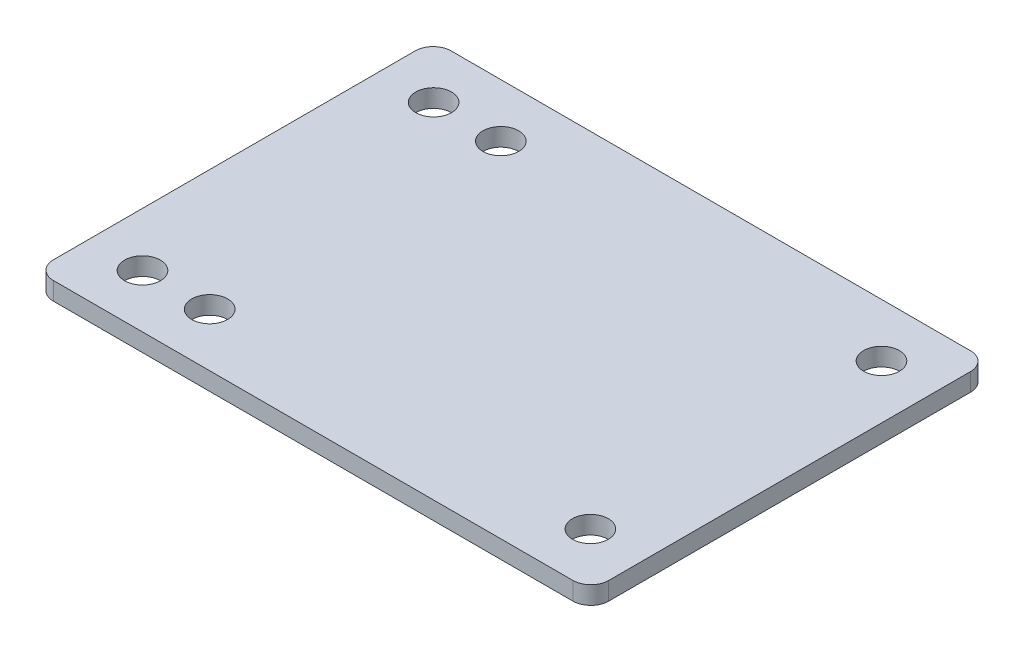
ISO-10303-21;
HEADER;
FILE_DESCRIPTION(('STEP AP214'),'2;1');
FILE_NAME('part.step','',(''),(''),'','','');
FILE_SCHEMA(('AUTOMOTIVE_DESIGN { 1 0 10303 214 1 1 1 1 }'));
ENDSEC;
DATA;
#1=APPLICATION_CONTEXT('core data for automotive mechanical design processes');
#2=APPLICATION_PROTOCOL_DEFINITION('international standard','automotive_design',2000,#1);
#3=PRODUCT_CONTEXT('',#1,'mechanical');
#4=PRODUCT('Part','Part','',(#3));
#5=PRODUCT_RELATED_PRODUCT_CATEGORY('part','',(#4));
#6=PRODUCT_DEFINITION_FORMATION('','',#4);
#7=PRODUCT_DEFINITION_CONTEXT('part definition',#1,'design');
#8=PRODUCT_DEFINITION('design','',#6,#7);
#9=PRODUCT_DEFINITION_SHAPE('','',#8);
#10=(LENGTH_UNIT() NAMED_UNIT(*) SI_UNIT(.MILLI.,.METRE.));
#11=(NAMED_UNIT(*) PLANE_ANGLE_UNIT() SI_UNIT($,.RADIAN.));
#12=(NAMED_UNIT(*) SI_UNIT($,.STERADIAN.) SOLID_ANGLE_UNIT());
#13=UNCERTAINTY_MEASURE_WITH_UNIT(LENGTH_MEASURE(1.E-05),#10,'distance_accuracy_value','');
#14=(GEOMETRIC_REPRESENTATION_CONTEXT(3) GLOBAL_UNCERTAINTY_ASSIGNED_CONTEXT((#13)) GLOBAL_UNIT_ASSIGNED_CONTEXT((#10,
#11,#12)) REPRESENTATION_CONTEXT('',''));
#15=CARTESIAN_POINT('',(0.,0.,0.));
#16=DIRECTION('',(0.,0.,1.));
#17=DIRECTION('',(1.,0.,0.));
#18=AXIS2_PLACEMENT_3D('',#15,#16,#17);
#19=CARTESIAN_POINT('',(39.37,2.54,28.194));
#20=DIRECTION('',(-1.,0.,0.));
#21=DIRECTION('',(0.,0.,1.));
#22=AXIS2_PLACEMENT_3D('',#19,#20,#21);
#23=PLANE('',#22);
#24=DIRECTION('',(0.,0.,-1.));
#25=VECTOR('',#24,1.);
#26=CARTESIAN_POINT('',(39.37,0.,28.194));
#27=LINE('',#26,#25);
#28=CARTESIAN_POINT('',(39.37,0.,25.654));
#29=VERTEX_POINT('',#28);
#30=CARTESIAN_POINT('',(39.37,0.,-25.654));
#31=VERTEX_POINT('',#30);
#32=EDGE_CURVE('E127',#29,#31,#27,.T.);
#33=ORIENTED_EDGE('',*,*,#32,.T.);
#34=DIRECTION('',(0.,-1.,0.));
#35=VECTOR('',#34,1.);
#36=CARTESIAN_POINT('',(39.37,2.54,-25.654));
#37=LINE('',#36,#35);
#38=CARTESIAN_POINT('',(39.37,2.54,-25.654));
#39=VERTEX_POINT('',#38);
#40=EDGE_CURVE('E104',#31,#39,#37,.F.);
#41=ORIENTED_EDGE('',*,*,#40,.T.);
#42=DIRECTION('',(0.,0.,-1.));
#43=VECTOR('',#42,1.);
#44=CARTESIAN_POINT('',(39.37,2.54,28.194));
#45=LINE('',#44,#43);
#46=CARTESIAN_POINT('',(39.37,2.54,25.654));
#47=VERTEX_POINT('',#46);
#48=EDGE_CURVE('E137',#47,#39,#45,.T.);
#49=ORIENTED_EDGE('',*,*,#48,.F.);
#50=DIRECTION('',(0.,-1.,0.));
#51=VECTOR('',#50,1.);
#52=CARTESIAN_POINT('',(39.37,2.54,25.654));
#53=LINE('',#52,#51);
#54=EDGE_CURVE('E109',#47,#29,#53,.T.);
#55=ORIENTED_EDGE('',*,*,#54,.T.);
#56=EDGE_LOOP('',(#33,#41,#49,#55));
#57=FACE_BOUND('',#56,.T.);
#58=ADVANCED_FACE('F32',(#57),#23,.F.);
#59=CARTESIAN_POINT('',(-39.37,2.54,-28.194));
#60=DIRECTION('',(0.,0.,1.));
#61=DIRECTION('',(1.,0.,0.));
#62=AXIS2_PLACEMENT_3D('',#59,#60,#61);
#63=PLANE('',#62);
#64=DIRECTION('',(-1.,0.,0.));
#65=VECTOR('',#64,1.);
#66=CARTESIAN_POINT('',(-39.37,2.54,-28.194));
#67=LINE('',#66,#65);
#68=CARTESIAN_POINT('',(36.83,2.54,-28.194));
#69=VERTEX_POINT('',#68);
#70=CARTESIAN_POINT('',(-36.83,2.54,-28.194));
#71=VERTEX_POINT('',#70);
#72=EDGE_CURVE('E119',#69,#71,#67,.T.);
#73=ORIENTED_EDGE('',*,*,#72,.F.);
#74=DIRECTION('',(0.,-1.,0.));
#75=VECTOR('',#74,1.);
#76=CARTESIAN_POINT('',(36.83,2.54,-28.194));
#77=LINE('',#76,#75);
#78=CARTESIAN_POINT('',(36.83,0.,-28.194));
#79=VERTEX_POINT('',#78);
#80=EDGE_CURVE('E103',#69,#79,#77,.T.);
#81=ORIENTED_EDGE('',*,*,#80,.T.);
#82=DIRECTION('',(-1.,0.,0.));
#83=VECTOR('',#82,1.);
#84=CARTESIAN_POINT('',(-39.37,0.,-28.194));
#85=LINE('',#84,#83);
#86=CARTESIAN_POINT('',(-36.83,0.,-28.194));
#87=VERTEX_POINT('',#86);
#88=EDGE_CURVE('E116',#79,#87,#85,.T.);
#89=ORIENTED_EDGE('',*,*,#88,.T.);
#90=DIRECTION('',(0.,-1.,0.));
#91=VECTOR('',#90,1.);
#92=CARTESIAN_POINT('',(-36.83,2.54,-28.194));
#93=LINE('',#92,#91);
#94=EDGE_CURVE('E121',#87,#71,#93,.F.);
#95=ORIENTED_EDGE('',*,*,#94,.T.);
#96=EDGE_LOOP('',(#73,#81,#89,#95));
#97=FACE_BOUND('',#96,.T.);
#98=ADVANCED_FACE('F115',(#97),#63,.F.);
#99=CARTESIAN_POINT('',(-39.37,2.54,28.194));
#100=DIRECTION('',(1.,0.,0.));
#101=DIRECTION('',(0.,0.,-1.));
#102=AXIS2_PLACEMENT_3D('',#99,#100,#101);
#103=PLANE('',#102);
#104=DIRECTION('',(0.,0.,1.));
#105=VECTOR('',#104,1.);
#106=CARTESIAN_POINT('',(-39.37,2.54,28.194));
#107=LINE('',#106,#105);
#108=CARTESIAN_POINT('',(-39.37,2.54,-25.654));
#109=VERTEX_POINT('',#108);
#110=CARTESIAN_POINT('',(-39.37,2.54,25.654));
#111=VERTEX_POINT('',#110);
#112=EDGE_CURVE('E160',#109,#111,#107,.T.);
#113=ORIENTED_EDGE('',*,*,#112,.F.);
#114=DIRECTION('',(0.,-1.,0.));
#115=VECTOR('',#114,1.);
#116=CARTESIAN_POINT('',(-39.37,2.54,-25.654));
#117=LINE('',#116,#115);
#118=CARTESIAN_POINT('',(-39.37,0.,-25.654));
#119=VERTEX_POINT('',#118);
#120=EDGE_CURVE('E11',#109,#119,#117,.T.);
#121=ORIENTED_EDGE('',*,*,#120,.T.);
#122=DIRECTION('',(0.,0.,1.));
#123=VECTOR('',#122,1.);
#124=CARTESIAN_POINT('',(-39.37,0.,28.194));
#125=LINE('',#124,#123);
#126=CARTESIAN_POINT('',(-39.37,0.,25.654));
#127=VERTEX_POINT('',#126);
#128=EDGE_CURVE('E126',#119,#127,#125,.T.);
#129=ORIENTED_EDGE('',*,*,#128,.T.);
#130=DIRECTION('',(0.,-1.,0.));
#131=VECTOR('',#130,1.);
#132=CARTESIAN_POINT('',(-39.37,2.54,25.654));
#133=LINE('',#132,#131);
#134=EDGE_CURVE('E40',#127,#111,#133,.F.);
#135=ORIENTED_EDGE('',*,*,#134,.T.);
#136=EDGE_LOOP('',(#113,#121,#129,#135));
#137=FACE_BOUND('',#136,.T.);
#138=ADVANCED_FACE('F159',(#137),#103,.F.);
#139=CARTESIAN_POINT('',(-39.37,2.54,28.194));
#140=DIRECTION('',(0.,0.,-1.));
#141=DIRECTION('',(-1.,0.,0.));
#142=AXIS2_PLACEMENT_3D('',#139,#140,#141);
#143=PLANE('',#142);
#144=DIRECTION('',(1.,0.,0.));
#145=VECTOR('',#144,1.);
#146=CARTESIAN_POINT('',(-39.37,0.,28.194));
#147=LINE('',#146,#145);
#148=CARTESIAN_POINT('',(-36.83,0.,28.194));
#149=VERTEX_POINT('',#148);
#150=CARTESIAN_POINT('',(36.83,0.,28.194));
#151=VERTEX_POINT('',#150);
#152=EDGE_CURVE('E130',#149,#151,#147,.T.);
#153=ORIENTED_EDGE('',*,*,#152,.T.);
#154=DIRECTION('',(0.,-1.,0.));
#155=VECTOR('',#154,1.);
#156=CARTESIAN_POINT('',(36.83,2.54,28.194));
#157=LINE('',#156,#155);
#158=CARTESIAN_POINT('',(36.83,2.54,28.194));
#159=VERTEX_POINT('',#158);
#160=EDGE_CURVE('E47',#151,#159,#157,.F.);
#161=ORIENTED_EDGE('',*,*,#160,.T.);
#162=DIRECTION('',(1.,0.,0.));
#163=VECTOR('',#162,1.);
#164=CARTESIAN_POINT('',(-39.37,2.54,28.194));
#165=LINE('',#164,#163);
#166=CARTESIAN_POINT('',(-36.83,2.54,28.194));
#167=VERTEX_POINT('',#166);
#168=EDGE_CURVE('E138',#167,#159,#165,.T.);
#169=ORIENTED_EDGE('',*,*,#168,.F.);
#170=DIRECTION('',(0.,-1.,0.));
#171=VECTOR('',#170,1.);
#172=CARTESIAN_POINT('',(-36.83,2.54,28.194));
#173=LINE('',#172,#171);
#174=EDGE_CURVE('E153',#167,#149,#173,.T.);
#175=ORIENTED_EDGE('',*,*,#174,.T.);
#176=EDGE_LOOP('',(#153,#161,#169,#175));
#177=FACE_BOUND('',#176,.T.);
#178=ADVANCED_FACE('F169',(#177),#143,.F.);
#179=CARTESIAN_POINT('',(0.,2.54,0.));
#180=DIRECTION('',(0.,-1.,0.));
#181=DIRECTION('',(0.,0.,-1.));
#182=AXIS2_PLACEMENT_3D('',#179,#180,#181);
#183=PLANE('',#182);
#184=CARTESIAN_POINT('',(31.75,2.54,20.6375));
#185=DIRECTION('',(0.,1.,0.));
#186=DIRECTION('',(0.,0.,1.));
#187=AXIS2_PLACEMENT_3D('',#184,#185,#186);
#188=CIRCLE('',#187,2.54);
#189=CARTESIAN_POINT('',(31.75,2.54,23.1775));
#190=VERTEX_POINT('',#189);
#191=EDGE_CURVE('E200',#190,#190,#188,.T.);
#192=ORIENTED_EDGE('',*,*,#191,.F.);
#193=EDGE_LOOP('',(#192));
#194=FACE_BOUND('',#193,.T.);
#195=CARTESIAN_POINT('',(-22.225,2.54,-20.6375));
#196=DIRECTION('',(0.,1.,0.));
#197=DIRECTION('',(0.,0.,1.));
#198=AXIS2_PLACEMENT_3D('',#195,#196,#197);
#199=CIRCLE('',#198,2.54);
#200=CARTESIAN_POINT('',(-22.225,2.54,-18.0975));
#201=VERTEX_POINT('',#200);
#202=EDGE_CURVE('E189',#201,#201,#199,.T.);
#203=ORIENTED_EDGE('',*,*,#202,.F.);
#204=EDGE_LOOP('',(#203));
#205=FACE_BOUND('',#204,.T.);
#206=CARTESIAN_POINT('',(-31.75,2.54,-20.6375));
#207=DIRECTION('',(0.,1.,0.));
#208=DIRECTION('',(0.,0.,1.));
#209=AXIS2_PLACEMENT_3D('',#206,#207,#208);
#210=CIRCLE('',#209,2.54);
#211=CARTESIAN_POINT('',(-31.75,2.54,-18.0975));
#212=VERTEX_POINT('',#211);
#213=EDGE_CURVE('E188',#212,#212,#210,.T.);
#214=ORIENTED_EDGE('',*,*,#213,.F.);
#215=EDGE_LOOP('',(#214));
#216=FACE_BOUND('',#215,.T.);
#217=CARTESIAN_POINT('',(-22.225,2.54,20.6375));
#218=DIRECTION('',(0.,1.,0.));
#219=DIRECTION('',(0.,0.,1.));
#220=AXIS2_PLACEMENT_3D('',#217,#218,#219);
#221=CIRCLE('',#220,2.54);
#222=CARTESIAN_POINT('',(-22.225,2.54,23.1775));
#223=VERTEX_POINT('',#222);
#224=EDGE_CURVE('E182',#223,#223,#221,.T.);
#225=ORIENTED_EDGE('',*,*,#224,.F.);
#226=EDGE_LOOP('',(#225));
#227=FACE_BOUND('',#226,.T.);
#228=CARTESIAN_POINT('',(31.75,2.54,-20.6375));
#229=DIRECTION('',(0.,1.,0.));
#230=DIRECTION('',(0.,0.,1.));
#231=AXIS2_PLACEMENT_3D('',#228,#229,#230);
#232=CIRCLE('',#231,2.54);
#233=CARTESIAN_POINT('',(31.75,2.54,-18.0975));
#234=VERTEX_POINT('',#233);
#235=EDGE_CURVE('E201',#234,#234,#232,.T.);
#236=ORIENTED_EDGE('',*,*,#235,.F.);
#237=EDGE_LOOP('',(#236));
#238=FACE_BOUND('',#237,.T.);
#239=CARTESIAN_POINT('',(-31.75,2.54,20.6375));
#240=DIRECTION('',(0.,1.,0.));
#241=DIRECTION('',(0.,0.,1.));
#242=AXIS2_PLACEMENT_3D('',#239,#240,#241);
#243=CIRCLE('',#242,2.54);
#244=CARTESIAN_POINT('',(-31.75,2.54,23.1775));
#245=VERTEX_POINT('',#244);
#246=EDGE_CURVE('E179',#245,#245,#243,.T.);
#247=ORIENTED_EDGE('',*,*,#246,.F.);
#248=EDGE_LOOP('',(#247));
#249=FACE_BOUND('',#248,.T.);
#250=ORIENTED_EDGE('',*,*,#48,.T.);
#251=CARTESIAN_POINT('',(36.83,2.54,-25.654));
#252=DIRECTION('',(0.,-1.,0.));
#253=DIRECTION('',(0.,0.,-1.));
#254=AXIS2_PLACEMENT_3D('',#251,#252,#253);
#255=CIRCLE('',#254,2.54);
#256=EDGE_CURVE('E151',#39,#69,#255,.F.);
#257=ORIENTED_EDGE('',*,*,#256,.T.);
#258=ORIENTED_EDGE('',*,*,#72,.T.);
#259=CARTESIAN_POINT('',(-36.83,2.54,-25.654));
#260=DIRECTION('',(0.,-1.,0.));
#261=DIRECTION('',(0.,0.,-1.));
#262=AXIS2_PLACEMENT_3D('',#259,#260,#261);
#263=CIRCLE('',#262,2.54);
#264=EDGE_CURVE('E147',#71,#109,#263,.F.);
#265=ORIENTED_EDGE('',*,*,#264,.T.);
#266=ORIENTED_EDGE('',*,*,#112,.T.);
#267=CARTESIAN_POINT('',(-36.83,2.54,25.654));
#268=DIRECTION('',(0.,-1.,0.));
#269=DIRECTION('',(0.,0.,-1.));
#270=AXIS2_PLACEMENT_3D('',#267,#268,#269);
#271=CIRCLE('',#270,2.54);
#272=EDGE_CURVE('E54',#111,#167,#271,.F.);
#273=ORIENTED_EDGE('',*,*,#272,.T.);
#274=ORIENTED_EDGE('',*,*,#168,.T.);
#275=CARTESIAN_POINT('',(36.83,2.54,25.654));
#276=DIRECTION('',(0.,-1.,0.));
#277=DIRECTION('',(0.,0.,-1.));
#278=AXIS2_PLACEMENT_3D('',#275,#276,#277);
#279=CIRCLE('',#278,2.54);
#280=EDGE_CURVE('E149',#159,#47,#279,.F.);
#281=ORIENTED_EDGE('',*,*,#280,.T.);
#282=EDGE_LOOP('',(#250,#257,#258,#265,#266,#273,#274,#281));
#283=FACE_BOUND('',#282,.T.);
#284=ADVANCED_FACE('F164',(#194,#205,#216,#227,#238,#249,#283),#183,.F.);
#285=CARTESIAN_POINT('',(0.,0.,0.));
#286=DIRECTION('',(0.,-1.,0.));
#287=DIRECTION('',(0.,0.,-1.));
#288=AXIS2_PLACEMENT_3D('',#285,#286,#287);
#289=PLANE('',#288);
#290=CARTESIAN_POINT('',(31.75,0.,20.6375));
#291=DIRECTION('',(0.,1.,0.));
#292=DIRECTION('',(0.,0.,1.));
#293=AXIS2_PLACEMENT_3D('',#290,#291,#292);
#294=CIRCLE('',#293,2.54);
#295=CARTESIAN_POINT('',(31.75,0.,23.1775));
#296=VERTEX_POINT('',#295);
#297=EDGE_CURVE('E197',#296,#296,#294,.T.);
#298=ORIENTED_EDGE('',*,*,#297,.T.);
#299=EDGE_LOOP('',(#298));
#300=FACE_BOUND('',#299,.T.);
#301=CARTESIAN_POINT('',(-22.225,0.,-20.6375));
#302=DIRECTION('',(0.,1.,0.));
#303=DIRECTION('',(0.,0.,1.));
#304=AXIS2_PLACEMENT_3D('',#301,#302,#303);
#305=CIRCLE('',#304,2.54);
#306=CARTESIAN_POINT('',(-22.225,0.,-18.0975));
#307=VERTEX_POINT('',#306);
#308=EDGE_CURVE('E204',#307,#307,#305,.T.);
#309=ORIENTED_EDGE('',*,*,#308,.T.);
#310=EDGE_LOOP('',(#309));
#311=FACE_BOUND('',#310,.T.);
#312=CARTESIAN_POINT('',(-31.75,0.,-20.6375));
#313=DIRECTION('',(0.,1.,0.));
#314=DIRECTION('',(0.,0.,1.));
#315=AXIS2_PLACEMENT_3D('',#312,#313,#314);
#316=CIRCLE('',#315,2.54);
#317=CARTESIAN_POINT('',(-31.75,0.,-18.0975));
#318=VERTEX_POINT('',#317);
#319=EDGE_CURVE('E185',#318,#318,#316,.T.);
#320=ORIENTED_EDGE('',*,*,#319,.T.);
#321=EDGE_LOOP('',(#320));
#322=FACE_BOUND('',#321,.T.);
#323=CARTESIAN_POINT('',(-22.225,0.,20.6375));
#324=DIRECTION('',(0.,1.,0.));
#325=DIRECTION('',(0.,0.,1.));
#326=AXIS2_PLACEMENT_3D('',#323,#324,#325);
#327=CIRCLE('',#326,2.54);
#328=CARTESIAN_POINT('',(-22.225,0.,23.1775));
#329=VERTEX_POINT('',#328);
#330=EDGE_CURVE('E192',#329,#329,#327,.T.);
#331=ORIENTED_EDGE('',*,*,#330,.T.);
#332=EDGE_LOOP('',(#331));
#333=FACE_BOUND('',#332,.T.);
#334=CARTESIAN_POINT('',(31.75,0.,-20.6375));
#335=DIRECTION('',(0.,1.,0.));
#336=DIRECTION('',(0.,0.,1.));
#337=AXIS2_PLACEMENT_3D('',#334,#335,#336);
#338=CIRCLE('',#337,2.54);
#339=CARTESIAN_POINT('',(31.75,0.,-18.0975));
#340=VERTEX_POINT('',#339);
#341=EDGE_CURVE('E209',#340,#340,#338,.T.);
#342=ORIENTED_EDGE('',*,*,#341,.T.);
#343=EDGE_LOOP('',(#342));
#344=FACE_BOUND('',#343,.T.);
#345=CARTESIAN_POINT('',(-31.75,0.,20.6375));
#346=DIRECTION('',(0.,1.,0.));
#347=DIRECTION('',(0.,0.,1.));
#348=AXIS2_PLACEMENT_3D('',#345,#346,#347);
#349=CIRCLE('',#348,2.54);
#350=CARTESIAN_POINT('',(-31.75,0.,23.1775));
#351=VERTEX_POINT('',#350);
#352=EDGE_CURVE('E132',#351,#351,#349,.T.);
#353=ORIENTED_EDGE('',*,*,#352,.T.);
#354=EDGE_LOOP('',(#353));
#355=FACE_BOUND('',#354,.T.);
#356=ORIENTED_EDGE('',*,*,#88,.F.);
#357=CARTESIAN_POINT('',(36.83,0.,-25.654));
#358=DIRECTION('',(0.,-1.,0.));
#359=DIRECTION('',(0.,0.,-1.));
#360=AXIS2_PLACEMENT_3D('',#357,#358,#359);
#361=CIRCLE('',#360,2.54);
#362=EDGE_CURVE('E99',#79,#31,#361,.T.);
#363=ORIENTED_EDGE('',*,*,#362,.T.);
#364=ORIENTED_EDGE('',*,*,#32,.F.);
#365=CARTESIAN_POINT('',(36.83,0.,25.654));
#366=DIRECTION('',(0.,-1.,0.));
#367=DIRECTION('',(0.,0.,-1.));
#368=AXIS2_PLACEMENT_3D('',#365,#366,#367);
#369=CIRCLE('',#368,2.54);
#370=EDGE_CURVE('E110',#29,#151,#369,.T.);
#371=ORIENTED_EDGE('',*,*,#370,.T.);
#372=ORIENTED_EDGE('',*,*,#152,.F.);
#373=CARTESIAN_POINT('',(-36.83,0.,25.654));
#374=DIRECTION('',(0.,-1.,0.));
#375=DIRECTION('',(0.,0.,-1.));
#376=AXIS2_PLACEMENT_3D('',#373,#374,#375);
#377=CIRCLE('',#376,2.54);
#378=EDGE_CURVE('E120',#149,#127,#377,.T.);
#379=ORIENTED_EDGE('',*,*,#378,.T.);
#380=ORIENTED_EDGE('',*,*,#128,.F.);
#381=CARTESIAN_POINT('',(-36.83,0.,-25.654));
#382=DIRECTION('',(0.,-1.,0.));
#383=DIRECTION('',(0.,0.,-1.));
#384=AXIS2_PLACEMENT_3D('',#381,#382,#383);
#385=CIRCLE('',#384,2.54);
#386=EDGE_CURVE('E125',#119,#87,#385,.T.);
#387=ORIENTED_EDGE('',*,*,#386,.T.);
#388=EDGE_LOOP('',(#356,#363,#364,#371,#372,#379,#380,#387));
#389=FACE_BOUND('',#388,.T.);
#390=ADVANCED_FACE('F123',(#300,#311,#322,#333,#344,#355,#389),#289,.T.);
#391=CARTESIAN_POINT('',(36.83,2.54,-25.654));
#392=DIRECTION('',(0.,-1.,0.));
#393=DIRECTION('',(0.,0.,-1.));
#394=AXIS2_PLACEMENT_3D('',#391,#392,#393);
#395=CYLINDRICAL_SURFACE('',#394,2.54);
#396=ORIENTED_EDGE('',*,*,#256,.F.);
#397=ORIENTED_EDGE('',*,*,#40,.F.);
#398=ORIENTED_EDGE('',*,*,#362,.F.);
#399=ORIENTED_EDGE('',*,*,#80,.F.);
#400=EDGE_LOOP('',(#396,#397,#398,#399));
#401=FACE_BOUND('',#400,.T.);
#402=ADVANCED_FACE('F102',(#401),#395,.T.);
#403=CARTESIAN_POINT('',(36.83,2.54,25.654));
#404=DIRECTION('',(0.,-1.,0.));
#405=DIRECTION('',(0.,0.,-1.));
#406=AXIS2_PLACEMENT_3D('',#403,#404,#405);
#407=CYLINDRICAL_SURFACE('',#406,2.54);
#408=ORIENTED_EDGE('',*,*,#280,.F.);
#409=ORIENTED_EDGE('',*,*,#160,.F.);
#410=ORIENTED_EDGE('',*,*,#370,.F.);
#411=ORIENTED_EDGE('',*,*,#54,.F.);
#412=EDGE_LOOP('',(#408,#409,#410,#411));
#413=FACE_BOUND('',#412,.T.);
#414=ADVANCED_FACE('F173',(#413),#407,.T.);
#415=CARTESIAN_POINT('',(-36.83,2.54,-25.654));
#416=DIRECTION('',(0.,-1.,0.));
#417=DIRECTION('',(0.,0.,-1.));
#418=AXIS2_PLACEMENT_3D('',#415,#416,#417);
#419=CYLINDRICAL_SURFACE('',#418,2.54);
#420=ORIENTED_EDGE('',*,*,#264,.F.);
#421=ORIENTED_EDGE('',*,*,#94,.F.);
#422=ORIENTED_EDGE('',*,*,#386,.F.);
#423=ORIENTED_EDGE('',*,*,#120,.F.);
#424=EDGE_LOOP('',(#420,#421,#422,#423));
#425=FACE_BOUND('',#424,.T.);
#426=ADVANCED_FACE('F234',(#425),#419,.T.);
#427=CARTESIAN_POINT('',(-36.83,2.54,25.654));
#428=DIRECTION('',(0.,-1.,0.));
#429=DIRECTION('',(0.,0.,-1.));
#430=AXIS2_PLACEMENT_3D('',#427,#428,#429);
#431=CYLINDRICAL_SURFACE('',#430,2.54);
#432=ORIENTED_EDGE('',*,*,#272,.F.);
#433=ORIENTED_EDGE('',*,*,#134,.F.);
#434=ORIENTED_EDGE('',*,*,#378,.F.);
#435=ORIENTED_EDGE('',*,*,#174,.F.);
#436=EDGE_LOOP('',(#432,#433,#434,#435));
#437=FACE_BOUND('',#436,.T.);
#438=ADVANCED_FACE('F34',(#437),#431,.T.);
#439=CARTESIAN_POINT('',(-31.75,0.,20.6375));
#440=DIRECTION('',(0.,1.,0.));
#441=DIRECTION('',(0.,0.,1.));
#442=AXIS2_PLACEMENT_3D('',#439,#440,#441);
#443=CYLINDRICAL_SURFACE('',#442,2.54);
#444=ORIENTED_EDGE('',*,*,#352,.F.);
#445=EDGE_LOOP('',(#444));
#446=FACE_BOUND('',#445,.T.);
#447=ORIENTED_EDGE('',*,*,#246,.T.);
#448=EDGE_LOOP('',(#447));
#449=FACE_BOUND('',#448,.T.);
#450=ADVANCED_FACE('F223',(#446,#449),#443,.F.);
#451=CARTESIAN_POINT('',(31.75,0.,-20.6375));
#452=DIRECTION('',(0.,1.,0.));
#453=DIRECTION('',(0.,0.,1.));
#454=AXIS2_PLACEMENT_3D('',#451,#452,#453);
#455=CYLINDRICAL_SURFACE('',#454,2.54);
#456=ORIENTED_EDGE('',*,*,#341,.F.);
#457=EDGE_LOOP('',(#456));
#458=FACE_BOUND('',#457,.T.);
#459=ORIENTED_EDGE('',*,*,#235,.T.);
#460=EDGE_LOOP('',(#459));
#461=FACE_BOUND('',#460,.T.);
#462=ADVANCED_FACE('F215',(#458,#461),#455,.F.);
#463=CARTESIAN_POINT('',(-22.225,0.,20.6375));
#464=DIRECTION('',(0.,1.,0.));
#465=DIRECTION('',(0.,0.,1.));
#466=AXIS2_PLACEMENT_3D('',#463,#464,#465);
#467=CYLINDRICAL_SURFACE('',#466,2.54);
#468=ORIENTED_EDGE('',*,*,#330,.F.);
#469=EDGE_LOOP('',(#468));
#470=FACE_BOUND('',#469,.T.);
#471=ORIENTED_EDGE('',*,*,#224,.T.);
#472=EDGE_LOOP('',(#471));
#473=FACE_BOUND('',#472,.T.);
#474=ADVANCED_FACE('F231',(#470,#473),#467,.F.);
#475=CARTESIAN_POINT('',(-31.75,0.,-20.6375));
#476=DIRECTION('',(0.,1.,0.));
#477=DIRECTION('',(0.,0.,1.));
#478=AXIS2_PLACEMENT_3D('',#475,#476,#477);
#479=CYLINDRICAL_SURFACE('',#478,2.54);
#480=ORIENTED_EDGE('',*,*,#319,.F.);
#481=EDGE_LOOP('',(#480));
#482=FACE_BOUND('',#481,.T.);
#483=ORIENTED_EDGE('',*,*,#213,.T.);
#484=EDGE_LOOP('',(#483));
#485=FACE_BOUND('',#484,.T.);
#486=ADVANCED_FACE('F295',(#482,#485),#479,.F.);
#487=CARTESIAN_POINT('',(-22.225,0.,-20.6375));
#488=DIRECTION('',(0.,1.,0.));
#489=DIRECTION('',(0.,0.,1.));
#490=AXIS2_PLACEMENT_3D('',#487,#488,#489);
#491=CYLINDRICAL_SURFACE('',#490,2.54);
#492=ORIENTED_EDGE('',*,*,#308,.F.);
#493=EDGE_LOOP('',(#492));
#494=FACE_BOUND('',#493,.T.);
#495=ORIENTED_EDGE('',*,*,#202,.T.);
#496=EDGE_LOOP('',(#495));
#497=FACE_BOUND('',#496,.T.);
#498=ADVANCED_FACE('F305',(#494,#497),#491,.F.);
#499=CARTESIAN_POINT('',(31.75,0.,20.6375));
#500=DIRECTION('',(0.,1.,0.));
#501=DIRECTION('',(0.,0.,1.));
#502=AXIS2_PLACEMENT_3D('',#499,#500,#501);
#503=CYLINDRICAL_SURFACE('',#502,2.54);
#504=ORIENTED_EDGE('',*,*,#297,.F.);
#505=EDGE_LOOP('',(#504));
#506=FACE_BOUND('',#505,.T.);
#507=ORIENTED_EDGE('',*,*,#191,.T.);
#508=EDGE_LOOP('',(#507));
#509=FACE_BOUND('',#508,.T.);
#510=ADVANCED_FACE('F314',(#506,#509),#503,.F.);
#511=CLOSED_SHELL('',(#58,#98,#138,#178,#284,#390,#402,#414,#426,#438,#450,#462,#474,#486,#498,#510));
#512=MANIFOLD_SOLID_BREP('B2',#511);
#513=ADVANCED_BREP_SHAPE_REPRESENTATION('',(#18,#512),#14);
#514=SHAPE_DEFINITION_REPRESENTATION(#9,#513);
ENDSEC;
END-ISO-10303-21;
